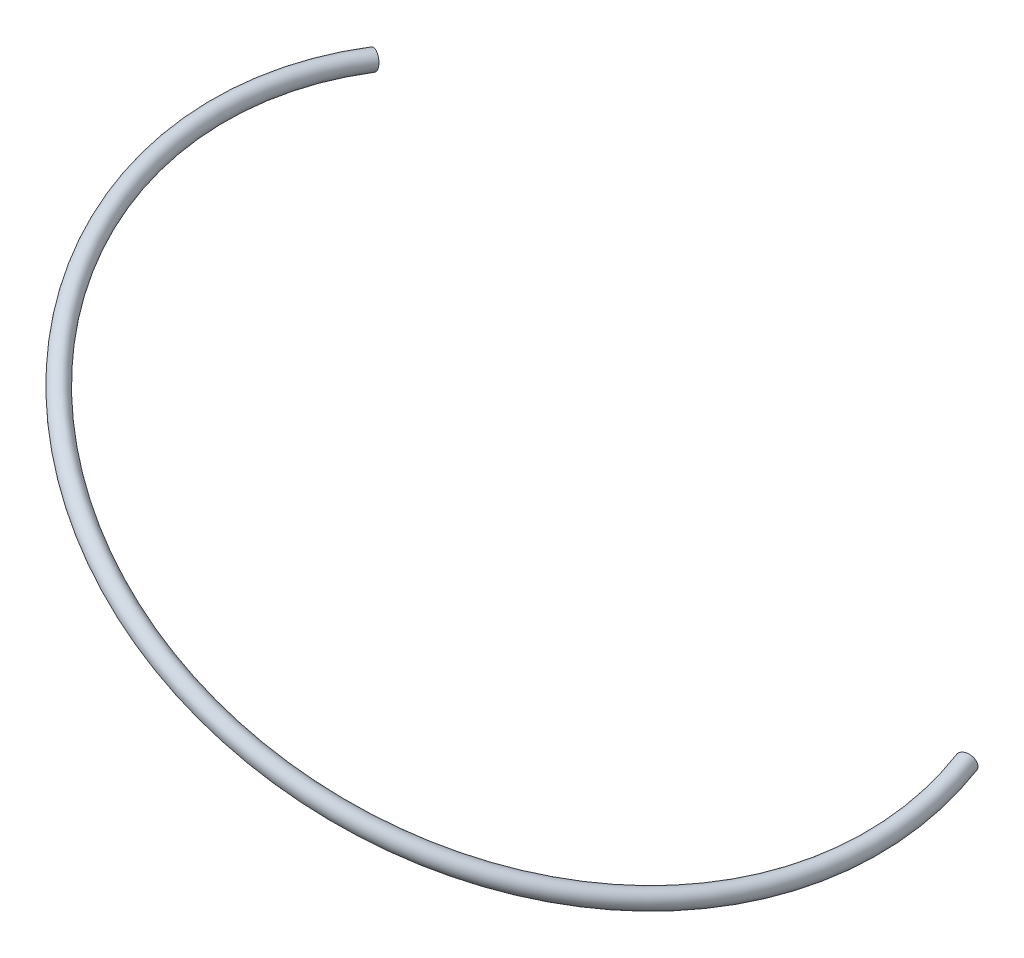
ISO-10303-21;
HEADER;
FILE_DESCRIPTION(('STEP AP214'),'2;1');
FILE_NAME('part.step','',(''),(''),'','','');
FILE_SCHEMA(('AUTOMOTIVE_DESIGN { 1 0 10303 214 1 1 1 1 }'));
ENDSEC;
DATA;
#1=APPLICATION_CONTEXT('core data for automotive mechanical design processes');
#2=APPLICATION_PROTOCOL_DEFINITION('international standard','automotive_design',2000,#1);
#3=PRODUCT_CONTEXT('',#1,'mechanical');
#4=PRODUCT('Part','Part','',(#3));
#5=PRODUCT_RELATED_PRODUCT_CATEGORY('part','',(#4));
#6=PRODUCT_DEFINITION_FORMATION('','',#4);
#7=PRODUCT_DEFINITION_CONTEXT('part definition',#1,'design');
#8=PRODUCT_DEFINITION('design','',#6,#7);
#9=PRODUCT_DEFINITION_SHAPE('','',#8);
#10=(LENGTH_UNIT() NAMED_UNIT(*) SI_UNIT(.MILLI.,.METRE.));
#11=(NAMED_UNIT(*) PLANE_ANGLE_UNIT() SI_UNIT($,.RADIAN.));
#12=(NAMED_UNIT(*) SI_UNIT($,.STERADIAN.) SOLID_ANGLE_UNIT());
#13=UNCERTAINTY_MEASURE_WITH_UNIT(LENGTH_MEASURE(1.E-05),#10,'distance_accuracy_value','');
#14=(GEOMETRIC_REPRESENTATION_CONTEXT(3) GLOBAL_UNCERTAINTY_ASSIGNED_CONTEXT((#13)) GLOBAL_UNIT_ASSIGNED_CONTEXT((#10,
#11,#12)) REPRESENTATION_CONTEXT('',''));
#15=CARTESIAN_POINT('',(0.,0.,0.));
#16=DIRECTION('',(0.,0.,1.));
#17=DIRECTION('',(1.,0.,0.));
#18=AXIS2_PLACEMENT_3D('',#15,#16,#17);
#19=CARTESIAN_POINT('',(105.000000000001,25.8499999999997,22.2500000000001));
#20=DIRECTION('',(-0.329737448101494,0.155577779380481,0.931165275277463));
#21=DIRECTION('',(0.942643233477194,0.,0.333801938849463));
#22=AXIS2_PLACEMENT_3D('',#19,#20,#21);
#23=PLANE('',#22);
#24=CARTESIAN_POINT('',(105.000000000001,25.8499999999997,22.2500000000001));
#25=DIRECTION('',(-0.329737448101494,0.155577779380481,0.931165275277463));
#26=DIRECTION('',(0.942643233477194,0.,0.333801938849463));
#27=AXIS2_PLACEMENT_3D('',#24,#25,#26);
#28=CIRCLE('',#27,1.99999999999999);
#29=CARTESIAN_POINT('',(103.31573071634,26.6446773305225,21.5208052931695));
#30=VERTEX_POINT('',#29);
#31=EDGE_CURVE('E55',#30,#30,#28,.T.);
#32=ORIENTED_EDGE('',*,*,#31,.F.);
#33=EDGE_LOOP('',(#32));
#34=FACE_BOUND('',#33,.T.);
#35=ADVANCED_FACE('F49',(#34),#23,.F.);
#36=CARTESIAN_POINT('',(240.75,-38.199999999999,27.0000000000019));
#37=DIRECTION('',(-0.275831895045446,0.130143888601551,-0.952354626142649));
#38=DIRECTION('',(-0.616910408215867,0.735833596688315,0.279231921920955));
#39=AXIS2_PLACEMENT_3D('',#36,#37,#38);
#40=PLANE('',#39);
#41=CARTESIAN_POINT('',(240.75,-38.199999999999,27.0000000000019));
#42=DIRECTION('',(-0.275831895045446,0.130143888601551,-0.952354626142649));
#43=DIRECTION('',(-0.616910408215867,0.735833596688315,0.279231921920955));
#44=AXIS2_PLACEMENT_3D('',#41,#42,#43);
#45=CIRCLE('',#44,1.99999999999999);
#46=CARTESIAN_POINT('',(242.47259607027,-39.0127607977946,26.3900142097914));
#47=VERTEX_POINT('',#46);
#48=EDGE_CURVE('E11',#47,#47,#45,.T.);
#49=ORIENTED_EDGE('',*,*,#48,.T.);
#50=EDGE_LOOP('',(#49));
#51=FACE_BOUND('',#50,.T.);
#52=ADVANCED_FACE('F64',(#51),#40,.T.);
#53=CARTESIAN_POINT('',(172.111415187921,-5.81472296711775,51.3055015149218));
#54=DIRECTION('',(0.426711214228877,0.904387936480423,0.));
#55=DIRECTION('',(-0.904387936480423,0.426711214228877,0.));
#56=AXIS2_PLACEMENT_3D('',#53,#54,#55);
#57=TOROIDAL_SURFACE('',#56,79.6920253061326,1.99999999999999);
#58=CARTESIAN_POINT('',(172.111415187921,-5.81472296711775,51.3055015149218));
#59=DIRECTION('',(0.426711214228877,0.904387936480423,0.));
#60=DIRECTION('',(-0.904387936480423,0.426711214228877,0.));
#61=AXIS2_PLACEMENT_3D('',#58,#59,#60);
#62=CIRCLE('',#61,81.6920253061326);
#63=EDGE_CURVE('',#30,#47,#62,.T.);
#64=ORIENTED_EDGE('',*,*,#31,.T.);
#65=ORIENTED_EDGE('',*,*,#48,.F.);
#66=ORIENTED_EDGE('',*,*,#63,.T.);
#67=ORIENTED_EDGE('',*,*,#63,.F.);
#68=EDGE_LOOP('',(#64,#66,#65,#67));
#69=FACE_BOUND('',#68,.T.);
#70=ADVANCED_FACE('F61',(#69),#57,.T.);
#71=CLOSED_SHELL('',(#35,#52,#70));
#72=MANIFOLD_SOLID_BREP('B2',#71);
#73=ADVANCED_BREP_SHAPE_REPRESENTATION('',(#18,#72),#14);
#74=SHAPE_DEFINITION_REPRESENTATION(#9,#73);
ENDSEC;
END-ISO-10303-21;
